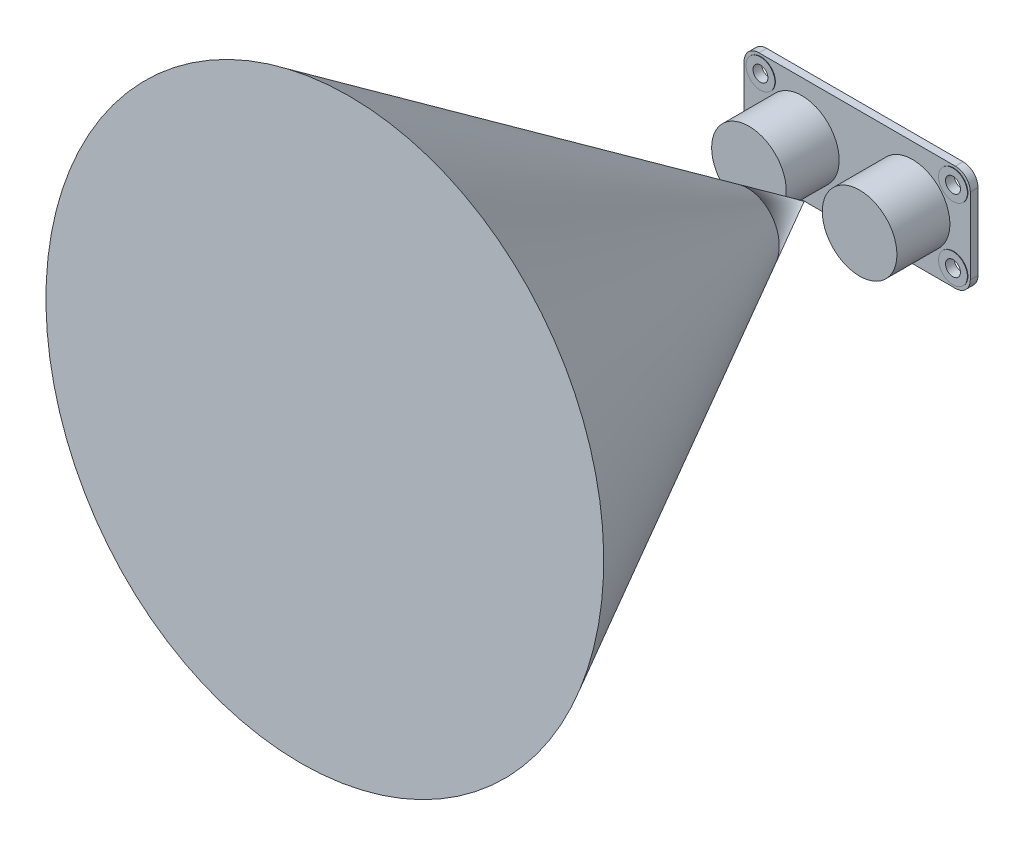
ISO-10303-21;
HEADER;
FILE_DESCRIPTION(('STEP AP214'),'2;1');
FILE_NAME('part.step','',(''),(''),'','','');
FILE_SCHEMA(('AUTOMOTIVE_DESIGN { 1 0 10303 214 1 1 1 1 }'));
ENDSEC;
DATA;
#1=APPLICATION_CONTEXT('core data for automotive mechanical design processes');
#2=APPLICATION_PROTOCOL_DEFINITION('international standard','automotive_design',2000,#1);
#3=PRODUCT_CONTEXT('',#1,'mechanical');
#4=PRODUCT('Part','Part','',(#3));
#5=PRODUCT_RELATED_PRODUCT_CATEGORY('part','',(#4));
#6=PRODUCT_DEFINITION_FORMATION('','',#4);
#7=PRODUCT_DEFINITION_CONTEXT('part definition',#1,'design');
#8=PRODUCT_DEFINITION('design','',#6,#7);
#9=PRODUCT_DEFINITION_SHAPE('','',#8);
#10=(LENGTH_UNIT() NAMED_UNIT(*) SI_UNIT(.MILLI.,.METRE.));
#11=(NAMED_UNIT(*) PLANE_ANGLE_UNIT() SI_UNIT($,.RADIAN.));
#12=(NAMED_UNIT(*) SI_UNIT($,.STERADIAN.) SOLID_ANGLE_UNIT());
#13=UNCERTAINTY_MEASURE_WITH_UNIT(LENGTH_MEASURE(1.E-05),#10,'distance_accuracy_value','');
#14=(GEOMETRIC_REPRESENTATION_CONTEXT(3) GLOBAL_UNCERTAINTY_ASSIGNED_CONTEXT((#13)) GLOBAL_UNIT_ASSIGNED_CONTEXT((#10,
#11,#12)) REPRESENTATION_CONTEXT('',''));
#15=CARTESIAN_POINT('',(0.,0.,0.));
#16=DIRECTION('',(0.,0.,1.));
#17=DIRECTION('',(1.,0.,0.));
#18=AXIS2_PLACEMENT_3D('',#15,#16,#17);
#19=CARTESIAN_POINT('',(0.,0.,12.6));
#20=DIRECTION('',(0.,0.0871557427476514,0.996194698091746));
#21=DIRECTION('',(0.,-0.996194698091746,0.0871557427476514));
#22=AXIS2_PLACEMENT_3D('',#19,#20,#21);
#23=CONICAL_SURFACE('',#22,0.,0.523598775598295);
#24=CARTESIAN_POINT('',(0.,8.71557427476514,112.219469809175));
#25=DIRECTION('',(0.,-0.0871557427476514,-0.996194698091746));
#26=DIRECTION('',(0.,0.996194698091746,-0.0871557427476514));
#27=AXIS2_PLACEMENT_3D('',#24,#25,#26);
#28=CIRCLE('',#27,57.7350269189621);
#29=CARTESIAN_POINT('',(0.,66.2309019856194,107.187530655497));
#30=VERTEX_POINT('',#29);
#31=EDGE_CURVE('E12',#30,#30,#28,.T.);
#32=ORIENTED_EDGE('',*,*,#31,.T.);
#33=EDGE_LOOP('',(#32));
#34=FACE_BOUND('',#33,.T.);
#35=CARTESIAN_POINT('',(0.,0.,12.6));
#36=VERTEX_POINT('',#35);
#37=VERTEX_LOOP('',#36);
#38=FACE_BOUND('',#37,.T.);
#39=ADVANCED_FACE('F61',(#34,#38),#23,.T.);
#40=CARTESIAN_POINT('',(0.,66.2309019856194,107.187530655497));
#41=DIRECTION('',(0.,0.0871557427476514,0.996194698091746));
#42=DIRECTION('',(0.,-0.996194698091746,0.0871557427476514));
#43=AXIS2_PLACEMENT_3D('',#40,#41,#42);
#44=PLANE('',#43);
#45=ORIENTED_EDGE('',*,*,#31,.F.);
#46=EDGE_LOOP('',(#45));
#47=FACE_BOUND('',#46,.T.);
#48=ADVANCED_FACE('F70',(#47),#44,.T.);
#49=CLOSED_SHELL('',(#39,#48));
#50=MANIFOLD_SOLID_BREP('B2_NOT_SHOWN',#49);
#51=CARTESIAN_POINT('',(0.,0.,1.6));
#52=DIRECTION('',(0.,0.,-1.));
#53=DIRECTION('',(-1.,0.,0.));
#54=AXIS2_PLACEMENT_3D('',#51,#52,#53);
#55=PLANE('',#54);
#56=CARTESIAN_POINT('',(-11.5,0.,1.6));
#57=DIRECTION('',(0.,0.,-1.));
#58=DIRECTION('',(-1.,0.,0.));
#59=AXIS2_PLACEMENT_3D('',#56,#57,#58);
#60=CIRCLE('',#59,7.75);
#61=CARTESIAN_POINT('',(-19.25,0.,1.6));
#62=VERTEX_POINT('',#61);
#63=EDGE_CURVE('E59',#62,#62,#60,.F.);
#64=ORIENTED_EDGE('',*,*,#63,.F.);
#65=EDGE_LOOP('',(#64));
#66=FACE_BOUND('',#65,.T.);
#67=CARTESIAN_POINT('',(11.5,0.,1.6));
#68=DIRECTION('',(0.,0.,-1.));
#69=DIRECTION('',(-1.,0.,0.));
#70=AXIS2_PLACEMENT_3D('',#67,#68,#69);
#71=CIRCLE('',#70,7.75);
#72=CARTESIAN_POINT('',(3.75,0.,1.6));
#73=VERTEX_POINT('',#72);
#74=EDGE_CURVE('E97',#73,#73,#71,.F.);
#75=ORIENTED_EDGE('',*,*,#74,.F.);
#76=EDGE_LOOP('',(#75));
#77=FACE_BOUND('',#76,.T.);
#78=CARTESIAN_POINT('',(20.,-7.5,1.6));
#79=DIRECTION('',(0.,0.,-1.));
#80=DIRECTION('',(-1.,0.,0.));
#81=AXIS2_PLACEMENT_3D('',#78,#79,#80);
#82=CIRCLE('',#81,3.);
#83=CARTESIAN_POINT('',(17.,-7.5,1.6));
#84=VERTEX_POINT('',#83);
#85=EDGE_CURVE('E238',#84,#84,#82,.T.);
#86=ORIENTED_EDGE('',*,*,#85,.T.);
#87=EDGE_LOOP('',(#86));
#88=FACE_BOUND('',#87,.T.);
#89=CARTESIAN_POINT('',(20.,7.5,1.6));
#90=DIRECTION('',(0.,0.,-1.));
#91=DIRECTION('',(-1.,0.,0.));
#92=AXIS2_PLACEMENT_3D('',#89,#90,#91);
#93=CIRCLE('',#92,3.);
#94=CARTESIAN_POINT('',(17.,7.5,1.6));
#95=VERTEX_POINT('',#94);
#96=EDGE_CURVE('E242',#95,#95,#93,.T.);
#97=ORIENTED_EDGE('',*,*,#96,.T.);
#98=EDGE_LOOP('',(#97));
#99=FACE_BOUND('',#98,.T.);
#100=CARTESIAN_POINT('',(-20.,-7.5,1.6));
#101=DIRECTION('',(0.,0.,-1.));
#102=DIRECTION('',(-1.,0.,0.));
#103=AXIS2_PLACEMENT_3D('',#100,#101,#102);
#104=CIRCLE('',#103,3.);
#105=CARTESIAN_POINT('',(-23.,-7.5,1.6));
#106=VERTEX_POINT('',#105);
#107=EDGE_CURVE('E246',#106,#106,#104,.T.);
#108=ORIENTED_EDGE('',*,*,#107,.T.);
#109=EDGE_LOOP('',(#108));
#110=FACE_BOUND('',#109,.T.);
#111=CARTESIAN_POINT('',(-20.,7.5,1.6));
#112=DIRECTION('',(0.,0.,-1.));
#113=DIRECTION('',(-1.,0.,0.));
#114=AXIS2_PLACEMENT_3D('',#111,#112,#113);
#115=CIRCLE('',#114,3.);
#116=CARTESIAN_POINT('',(-23.,7.5,1.6));
#117=VERTEX_POINT('',#116);
#118=EDGE_CURVE('E249',#117,#117,#115,.T.);
#119=ORIENTED_EDGE('',*,*,#118,.T.);
#120=EDGE_LOOP('',(#119));
#121=FACE_BOUND('',#120,.T.);
#122=DIRECTION('',(-1.,0.,0.));
#123=VECTOR('',#122,1.);
#124=CARTESIAN_POINT('',(-23.5,11.,1.6));
#125=LINE('',#124,#123);
#126=CARTESIAN_POINT('',(20.4,11.,1.6));
#127=VERTEX_POINT('',#126);
#128=CARTESIAN_POINT('',(-20.4,11.,1.6));
#129=VERTEX_POINT('',#128);
#130=EDGE_CURVE('E252',#127,#129,#125,.T.);
#131=ORIENTED_EDGE('',*,*,#130,.T.);
#132=CARTESIAN_POINT('',(-20.4,7.9,1.6));
#133=DIRECTION('',(0.,0.,-1.));
#134=DIRECTION('',(-1.,0.,0.));
#135=AXIS2_PLACEMENT_3D('',#132,#133,#134);
#136=CIRCLE('',#135,3.1);
#137=CARTESIAN_POINT('',(-23.5,7.9,1.6));
#138=VERTEX_POINT('',#137);
#139=EDGE_CURVE('E204',#129,#138,#136,.F.);
#140=ORIENTED_EDGE('',*,*,#139,.T.);
#141=DIRECTION('',(0.,-1.,0.));
#142=VECTOR('',#141,1.);
#143=CARTESIAN_POINT('',(-23.5,-11.,1.6));
#144=LINE('',#143,#142);
#145=CARTESIAN_POINT('',(-23.5,-7.9,1.6));
#146=VERTEX_POINT('',#145);
#147=EDGE_CURVE('E175',#138,#146,#144,.T.);
#148=ORIENTED_EDGE('',*,*,#147,.T.);
#149=CARTESIAN_POINT('',(-20.4,-7.9,1.6));
#150=DIRECTION('',(0.,0.,-1.));
#151=DIRECTION('',(-1.,0.,0.));
#152=AXIS2_PLACEMENT_3D('',#149,#150,#151);
#153=CIRCLE('',#152,3.1);
#154=CARTESIAN_POINT('',(-20.4,-11.,1.6));
#155=VERTEX_POINT('',#154);
#156=EDGE_CURVE('E111',#146,#155,#153,.F.);
#157=ORIENTED_EDGE('',*,*,#156,.T.);
#158=DIRECTION('',(1.,0.,0.));
#159=VECTOR('',#158,1.);
#160=CARTESIAN_POINT('',(-23.5,-11.,1.6));
#161=LINE('',#160,#159);
#162=CARTESIAN_POINT('',(20.4,-11.,1.6));
#163=VERTEX_POINT('',#162);
#164=EDGE_CURVE('E190',#155,#163,#161,.T.);
#165=ORIENTED_EDGE('',*,*,#164,.T.);
#166=CARTESIAN_POINT('',(20.4,-7.9,1.6));
#167=DIRECTION('',(0.,0.,-1.));
#168=DIRECTION('',(-1.,0.,0.));
#169=AXIS2_PLACEMENT_3D('',#166,#167,#168);
#170=CIRCLE('',#169,3.1);
#171=CARTESIAN_POINT('',(23.5,-7.9,1.6));
#172=VERTEX_POINT('',#171);
#173=EDGE_CURVE('E201',#163,#172,#170,.F.);
#174=ORIENTED_EDGE('',*,*,#173,.T.);
#175=DIRECTION('',(0.,1.,0.));
#176=VECTOR('',#175,1.);
#177=CARTESIAN_POINT('',(23.5,-11.,1.6));
#178=LINE('',#177,#176);
#179=CARTESIAN_POINT('',(23.5,7.9,1.6));
#180=VERTEX_POINT('',#179);
#181=EDGE_CURVE('E184',#172,#180,#178,.T.);
#182=ORIENTED_EDGE('',*,*,#181,.T.);
#183=CARTESIAN_POINT('',(20.4,7.9,1.6));
#184=DIRECTION('',(0.,0.,-1.));
#185=DIRECTION('',(-1.,0.,0.));
#186=AXIS2_PLACEMENT_3D('',#183,#184,#185);
#187=CIRCLE('',#186,3.1);
#188=EDGE_CURVE('E199',#180,#127,#187,.F.);
#189=ORIENTED_EDGE('',*,*,#188,.T.);
#190=EDGE_LOOP('',(#131,#140,#148,#157,#165,#174,#182,#189));
#191=FACE_BOUND('',#190,.T.);
#192=ADVANCED_FACE('F89',(#66,#77,#88,#99,#110,#121,#191),#55,.F.);
#193=CARTESIAN_POINT('',(0.,0.,0.));
#194=DIRECTION('',(0.,0.,-1.));
#195=DIRECTION('',(-1.,0.,0.));
#196=AXIS2_PLACEMENT_3D('',#193,#194,#195);
#197=PLANE('',#196);
#198=CARTESIAN_POINT('',(20.,-7.5,0.));
#199=DIRECTION('',(0.,0.,-1.));
#200=DIRECTION('',(-1.,0.,0.));
#201=AXIS2_PLACEMENT_3D('',#198,#199,#200);
#202=CIRCLE('',#201,3.);
#203=CARTESIAN_POINT('',(17.,-7.5,0.));
#204=VERTEX_POINT('',#203);
#205=EDGE_CURVE('E224',#204,#204,#202,.T.);
#206=ORIENTED_EDGE('',*,*,#205,.F.);
#207=EDGE_LOOP('',(#206));
#208=FACE_BOUND('',#207,.T.);
#209=CARTESIAN_POINT('',(20.,7.5,0.));
#210=DIRECTION('',(0.,0.,-1.));
#211=DIRECTION('',(-1.,0.,0.));
#212=AXIS2_PLACEMENT_3D('',#209,#210,#211);
#213=CIRCLE('',#212,3.);
#214=CARTESIAN_POINT('',(17.,7.5,0.));
#215=VERTEX_POINT('',#214);
#216=EDGE_CURVE('E221',#215,#215,#213,.T.);
#217=ORIENTED_EDGE('',*,*,#216,.F.);
#218=EDGE_LOOP('',(#217));
#219=FACE_BOUND('',#218,.T.);
#220=CARTESIAN_POINT('',(-20.,-7.5,0.));
#221=DIRECTION('',(0.,0.,-1.));
#222=DIRECTION('',(-1.,0.,0.));
#223=AXIS2_PLACEMENT_3D('',#220,#221,#222);
#224=CIRCLE('',#223,3.);
#225=CARTESIAN_POINT('',(-23.,-7.5,0.));
#226=VERTEX_POINT('',#225);
#227=EDGE_CURVE('E218',#226,#226,#224,.T.);
#228=ORIENTED_EDGE('',*,*,#227,.F.);
#229=EDGE_LOOP('',(#228));
#230=FACE_BOUND('',#229,.T.);
#231=CARTESIAN_POINT('',(-20.,7.5,0.));
#232=DIRECTION('',(0.,0.,-1.));
#233=DIRECTION('',(-1.,0.,0.));
#234=AXIS2_PLACEMENT_3D('',#231,#232,#233);
#235=CIRCLE('',#234,3.);
#236=CARTESIAN_POINT('',(-23.,7.5,0.));
#237=VERTEX_POINT('',#236);
#238=EDGE_CURVE('E215',#237,#237,#235,.T.);
#239=ORIENTED_EDGE('',*,*,#238,.F.);
#240=EDGE_LOOP('',(#239));
#241=FACE_BOUND('',#240,.T.);
#242=DIRECTION('',(0.,-1.,0.));
#243=VECTOR('',#242,1.);
#244=CARTESIAN_POINT('',(-23.5,-11.,0.));
#245=LINE('',#244,#243);
#246=CARTESIAN_POINT('',(-23.5,7.9,0.));
#247=VERTEX_POINT('',#246);
#248=CARTESIAN_POINT('',(-23.5,-7.9,0.));
#249=VERTEX_POINT('',#248);
#250=EDGE_CURVE('E173',#247,#249,#245,.T.);
#251=ORIENTED_EDGE('',*,*,#250,.F.);
#252=CARTESIAN_POINT('',(-20.4,7.9,0.));
#253=DIRECTION('',(0.,0.,-1.));
#254=DIRECTION('',(-1.,0.,0.));
#255=AXIS2_PLACEMENT_3D('',#252,#253,#254);
#256=CIRCLE('',#255,3.1);
#257=CARTESIAN_POINT('',(-20.4,11.,0.));
#258=VERTEX_POINT('',#257);
#259=EDGE_CURVE('E156',#247,#258,#256,.T.);
#260=ORIENTED_EDGE('',*,*,#259,.T.);
#261=DIRECTION('',(-1.,0.,0.));
#262=VECTOR('',#261,1.);
#263=CARTESIAN_POINT('',(-23.5,11.,0.));
#264=LINE('',#263,#262);
#265=CARTESIAN_POINT('',(20.4,11.,0.));
#266=VERTEX_POINT('',#265);
#267=EDGE_CURVE('E182',#266,#258,#264,.T.);
#268=ORIENTED_EDGE('',*,*,#267,.F.);
#269=CARTESIAN_POINT('',(20.4,7.9,0.));
#270=DIRECTION('',(0.,0.,-1.));
#271=DIRECTION('',(-1.,0.,0.));
#272=AXIS2_PLACEMENT_3D('',#269,#270,#271);
#273=CIRCLE('',#272,3.1);
#274=CARTESIAN_POINT('',(23.5,7.9,0.));
#275=VERTEX_POINT('',#274);
#276=EDGE_CURVE('E176',#266,#275,#273,.T.);
#277=ORIENTED_EDGE('',*,*,#276,.T.);
#278=DIRECTION('',(0.,1.,0.));
#279=VECTOR('',#278,1.);
#280=CARTESIAN_POINT('',(23.5,-11.,0.));
#281=LINE('',#280,#279);
#282=CARTESIAN_POINT('',(23.5,-7.9,0.));
#283=VERTEX_POINT('',#282);
#284=EDGE_CURVE('E186',#283,#275,#281,.T.);
#285=ORIENTED_EDGE('',*,*,#284,.F.);
#286=CARTESIAN_POINT('',(20.4,-7.9,0.));
#287=DIRECTION('',(0.,0.,-1.));
#288=DIRECTION('',(-1.,0.,0.));
#289=AXIS2_PLACEMENT_3D('',#286,#287,#288);
#290=CIRCLE('',#289,3.1);
#291=CARTESIAN_POINT('',(20.4,-11.,0.));
#292=VERTEX_POINT('',#291);
#293=EDGE_CURVE('E193',#283,#292,#290,.T.);
#294=ORIENTED_EDGE('',*,*,#293,.T.);
#295=DIRECTION('',(1.,0.,0.));
#296=VECTOR('',#295,1.);
#297=CARTESIAN_POINT('',(-23.5,-11.,0.));
#298=LINE('',#297,#296);
#299=CARTESIAN_POINT('',(-20.4,-11.,0.));
#300=VERTEX_POINT('',#299);
#301=EDGE_CURVE('E181',#300,#292,#298,.T.);
#302=ORIENTED_EDGE('',*,*,#301,.F.);
#303=CARTESIAN_POINT('',(-20.4,-7.9,0.));
#304=DIRECTION('',(0.,0.,-1.));
#305=DIRECTION('',(-1.,0.,0.));
#306=AXIS2_PLACEMENT_3D('',#303,#304,#305);
#307=CIRCLE('',#306,3.1);
#308=EDGE_CURVE('E167',#300,#249,#307,.T.);
#309=ORIENTED_EDGE('',*,*,#308,.T.);
#310=EDGE_LOOP('',(#251,#260,#268,#277,#285,#294,#302,#309));
#311=FACE_BOUND('',#310,.T.);
#312=ADVANCED_FACE('F179',(#208,#219,#230,#241,#311),#197,.T.);
#313=CARTESIAN_POINT('',(23.5,-11.,1.6));
#314=DIRECTION('',(-1.,0.,0.));
#315=DIRECTION('',(0.,0.,1.));
#316=AXIS2_PLACEMENT_3D('',#313,#314,#315);
#317=PLANE('',#316);
#318=ORIENTED_EDGE('',*,*,#181,.F.);
#319=DIRECTION('',(0.,0.,-1.));
#320=VECTOR('',#319,1.);
#321=CARTESIAN_POINT('',(23.5,-7.9,1.6));
#322=LINE('',#321,#320);
#323=EDGE_CURVE('E212',#172,#283,#322,.T.);
#324=ORIENTED_EDGE('',*,*,#323,.T.);
#325=ORIENTED_EDGE('',*,*,#284,.T.);
#326=DIRECTION('',(0.,0.,-1.));
#327=VECTOR('',#326,1.);
#328=CARTESIAN_POINT('',(23.5,7.9,1.6));
#329=LINE('',#328,#327);
#330=EDGE_CURVE('E210',#275,#180,#329,.F.);
#331=ORIENTED_EDGE('',*,*,#330,.T.);
#332=EDGE_LOOP('',(#318,#324,#325,#331));
#333=FACE_BOUND('',#332,.T.);
#334=ADVANCED_FACE('F414',(#333),#317,.F.);
#335=CARTESIAN_POINT('',(-23.5,11.,1.6));
#336=DIRECTION('',(0.,-1.,0.));
#337=DIRECTION('',(0.,0.,-1.));
#338=AXIS2_PLACEMENT_3D('',#335,#336,#337);
#339=PLANE('',#338);
#340=ORIENTED_EDGE('',*,*,#267,.T.);
#341=DIRECTION('',(0.,0.,-1.));
#342=VECTOR('',#341,1.);
#343=CARTESIAN_POINT('',(-20.4,11.,1.6));
#344=LINE('',#343,#342);
#345=EDGE_CURVE('E161',#258,#129,#344,.F.);
#346=ORIENTED_EDGE('',*,*,#345,.T.);
#347=ORIENTED_EDGE('',*,*,#130,.F.);
#348=DIRECTION('',(0.,0.,-1.));
#349=VECTOR('',#348,1.);
#350=CARTESIAN_POINT('',(20.4,11.,1.6));
#351=LINE('',#350,#349);
#352=EDGE_CURVE('E166',#127,#266,#351,.T.);
#353=ORIENTED_EDGE('',*,*,#352,.T.);
#354=EDGE_LOOP('',(#340,#346,#347,#353));
#355=FACE_BOUND('',#354,.T.);
#356=ADVANCED_FACE('F421',(#355),#339,.F.);
#357=CARTESIAN_POINT('',(-23.5,-11.,1.6));
#358=DIRECTION('',(1.,0.,0.));
#359=DIRECTION('',(0.,0.,-1.));
#360=AXIS2_PLACEMENT_3D('',#357,#358,#359);
#361=PLANE('',#360);
#362=ORIENTED_EDGE('',*,*,#147,.F.);
#363=DIRECTION('',(0.,0.,-1.));
#364=VECTOR('',#363,1.);
#365=CARTESIAN_POINT('',(-23.5,7.9,1.6));
#366=LINE('',#365,#364);
#367=EDGE_CURVE('E160',#138,#247,#366,.T.);
#368=ORIENTED_EDGE('',*,*,#367,.T.);
#369=ORIENTED_EDGE('',*,*,#250,.T.);
#370=DIRECTION('',(0.,0.,-1.));
#371=VECTOR('',#370,1.);
#372=CARTESIAN_POINT('',(-23.5,-7.9,1.6));
#373=LINE('',#372,#371);
#374=EDGE_CURVE('E177',#249,#146,#373,.F.);
#375=ORIENTED_EDGE('',*,*,#374,.T.);
#376=EDGE_LOOP('',(#362,#368,#369,#375));
#377=FACE_BOUND('',#376,.T.);
#378=ADVANCED_FACE('F172',(#377),#361,.F.);
#379=CARTESIAN_POINT('',(-23.5,-11.,1.6));
#380=DIRECTION('',(0.,1.,0.));
#381=DIRECTION('',(0.,0.,1.));
#382=AXIS2_PLACEMENT_3D('',#379,#380,#381);
#383=PLANE('',#382);
#384=ORIENTED_EDGE('',*,*,#164,.F.);
#385=DIRECTION('',(0.,0.,-1.));
#386=VECTOR('',#385,1.);
#387=CARTESIAN_POINT('',(-20.4,-11.,1.6));
#388=LINE('',#387,#386);
#389=EDGE_CURVE('E207',#155,#300,#388,.T.);
#390=ORIENTED_EDGE('',*,*,#389,.T.);
#391=ORIENTED_EDGE('',*,*,#301,.T.);
#392=DIRECTION('',(0.,0.,-1.));
#393=VECTOR('',#392,1.);
#394=CARTESIAN_POINT('',(20.4,-11.,1.6));
#395=LINE('',#394,#393);
#396=EDGE_CURVE('E104',#292,#163,#395,.F.);
#397=ORIENTED_EDGE('',*,*,#396,.T.);
#398=EDGE_LOOP('',(#384,#390,#391,#397));
#399=FACE_BOUND('',#398,.T.);
#400=ADVANCED_FACE('F416',(#399),#383,.F.);
#401=CARTESIAN_POINT('',(-20.4,7.9,1.6));
#402=DIRECTION('',(0.,0.,-1.));
#403=DIRECTION('',(-1.,0.,0.));
#404=AXIS2_PLACEMENT_3D('',#401,#402,#403);
#405=CYLINDRICAL_SURFACE('',#404,3.1);
#406=ORIENTED_EDGE('',*,*,#139,.F.);
#407=ORIENTED_EDGE('',*,*,#345,.F.);
#408=ORIENTED_EDGE('',*,*,#259,.F.);
#409=ORIENTED_EDGE('',*,*,#367,.F.);
#410=EDGE_LOOP('',(#406,#407,#408,#409));
#411=FACE_BOUND('',#410,.T.);
#412=ADVANCED_FACE('F159',(#411),#405,.T.);
#413=CARTESIAN_POINT('',(-20.4,-7.9,1.6));
#414=DIRECTION('',(0.,0.,-1.));
#415=DIRECTION('',(-1.,0.,0.));
#416=AXIS2_PLACEMENT_3D('',#413,#414,#415);
#417=CYLINDRICAL_SURFACE('',#416,3.1);
#418=ORIENTED_EDGE('',*,*,#156,.F.);
#419=ORIENTED_EDGE('',*,*,#374,.F.);
#420=ORIENTED_EDGE('',*,*,#308,.F.);
#421=ORIENTED_EDGE('',*,*,#389,.F.);
#422=EDGE_LOOP('',(#418,#419,#420,#421));
#423=FACE_BOUND('',#422,.T.);
#424=ADVANCED_FACE('F428',(#423),#417,.T.);
#425=CARTESIAN_POINT('',(20.4,-7.9,1.6));
#426=DIRECTION('',(0.,0.,-1.));
#427=DIRECTION('',(-1.,0.,0.));
#428=AXIS2_PLACEMENT_3D('',#425,#426,#427);
#429=CYLINDRICAL_SURFACE('',#428,3.1);
#430=ORIENTED_EDGE('',*,*,#173,.F.);
#431=ORIENTED_EDGE('',*,*,#396,.F.);
#432=ORIENTED_EDGE('',*,*,#293,.F.);
#433=ORIENTED_EDGE('',*,*,#323,.F.);
#434=EDGE_LOOP('',(#430,#431,#432,#433));
#435=FACE_BOUND('',#434,.T.);
#436=ADVANCED_FACE('F430',(#435),#429,.T.);
#437=CARTESIAN_POINT('',(20.4,7.9,1.6));
#438=DIRECTION('',(0.,0.,-1.));
#439=DIRECTION('',(-1.,0.,0.));
#440=AXIS2_PLACEMENT_3D('',#437,#438,#439);
#441=CYLINDRICAL_SURFACE('',#440,3.1);
#442=ORIENTED_EDGE('',*,*,#188,.F.);
#443=ORIENTED_EDGE('',*,*,#330,.F.);
#444=ORIENTED_EDGE('',*,*,#276,.F.);
#445=ORIENTED_EDGE('',*,*,#352,.F.);
#446=EDGE_LOOP('',(#442,#443,#444,#445));
#447=FACE_BOUND('',#446,.T.);
#448=ADVANCED_FACE('F91',(#447),#441,.T.);
#449=CARTESIAN_POINT('',(-20.,7.5,-0.0999999999999998));
#450=DIRECTION('',(0.,0.,1.));
#451=DIRECTION('',(1.,0.,0.));
#452=AXIS2_PLACEMENT_3D('',#449,#450,#451);
#453=CYLINDRICAL_SURFACE('',#452,3.);
#454=ORIENTED_EDGE('',*,*,#238,.T.);
#455=EDGE_LOOP('',(#454));
#456=FACE_BOUND('',#455,.T.);
#457=CARTESIAN_POINT('',(-20.,7.5,-0.0999999999999998));
#458=DIRECTION('',(0.,0.,1.));
#459=DIRECTION('',(1.,0.,0.));
#460=AXIS2_PLACEMENT_3D('',#457,#458,#459);
#461=CIRCLE('',#460,3.);
#462=CARTESIAN_POINT('',(-17.,7.5,-0.0999999999999998));
#463=VERTEX_POINT('',#462);
#464=EDGE_CURVE('E266',#463,#463,#461,.T.);
#465=ORIENTED_EDGE('',*,*,#464,.T.);
#466=EDGE_LOOP('',(#465));
#467=FACE_BOUND('',#466,.T.);
#468=ADVANCED_FACE('F395',(#456,#467),#453,.T.);
#469=CARTESIAN_POINT('',(-20.,7.5,-0.0999999999999998));
#470=DIRECTION('',(0.,0.,1.));
#471=DIRECTION('',(1.,0.,0.));
#472=AXIS2_PLACEMENT_3D('',#469,#470,#471);
#473=PLANE('',#472);
#474=CARTESIAN_POINT('',(-20.,7.5,-0.0999999999999998));
#475=DIRECTION('',(0.,0.,1.));
#476=DIRECTION('',(1.,0.,0.));
#477=AXIS2_PLACEMENT_3D('',#474,#475,#476);
#478=CIRCLE('',#477,1.55);
#479=CARTESIAN_POINT('',(-18.45,7.5,-0.0999999999999998));
#480=VERTEX_POINT('',#479);
#481=EDGE_CURVE('E268',#480,#480,#478,.T.);
#482=ORIENTED_EDGE('',*,*,#481,.T.);
#483=EDGE_LOOP('',(#482));
#484=FACE_BOUND('',#483,.T.);
#485=ORIENTED_EDGE('',*,*,#464,.F.);
#486=EDGE_LOOP('',(#485));
#487=FACE_BOUND('',#486,.T.);
#488=ADVANCED_FACE('F391',(#484,#487),#473,.F.);
#489=CARTESIAN_POINT('',(-20.,7.5,1.6));
#490=DIRECTION('',(0.,0.,-1.));
#491=DIRECTION('',(-1.,0.,0.));
#492=AXIS2_PLACEMENT_3D('',#489,#490,#491);
#493=CYLINDRICAL_SURFACE('',#492,1.55);
#494=ORIENTED_EDGE('',*,*,#481,.F.);
#495=EDGE_LOOP('',(#494));
#496=FACE_BOUND('',#495,.T.);
#497=CARTESIAN_POINT('',(-20.,7.5,1.7));
#498=DIRECTION('',(0.,0.,1.));
#499=DIRECTION('',(1.,0.,0.));
#500=AXIS2_PLACEMENT_3D('',#497,#498,#499);
#501=CIRCLE('',#500,1.55);
#502=CARTESIAN_POINT('',(-18.45,7.5,1.7));
#503=VERTEX_POINT('',#502);
#504=EDGE_CURVE('E276',#503,#503,#501,.T.);
#505=ORIENTED_EDGE('',*,*,#504,.T.);
#506=EDGE_LOOP('',(#505));
#507=FACE_BOUND('',#506,.T.);
#508=ADVANCED_FACE('F394',(#496,#507),#493,.F.);
#509=CARTESIAN_POINT('',(-20.,7.5,1.7));
#510=DIRECTION('',(0.,0.,1.));
#511=DIRECTION('',(1.,0.,0.));
#512=AXIS2_PLACEMENT_3D('',#509,#510,#511);
#513=CIRCLE('',#512,3.);
#514=CARTESIAN_POINT('',(-17.,7.5,1.7));
#515=VERTEX_POINT('',#514);
#516=EDGE_CURVE('E273',#515,#515,#513,.T.);
#517=ORIENTED_EDGE('',*,*,#516,.F.);
#518=EDGE_LOOP('',(#517));
#519=FACE_BOUND('',#518,.T.);
#520=ORIENTED_EDGE('',*,*,#118,.F.);
#521=EDGE_LOOP('',(#520));
#522=FACE_BOUND('',#521,.T.);
#523=ADVANCED_FACE('F389',(#519,#522),#453,.T.);
#524=CARTESIAN_POINT('',(-20.,7.5,1.7));
#525=DIRECTION('',(0.,0.,1.));
#526=DIRECTION('',(1.,0.,0.));
#527=AXIS2_PLACEMENT_3D('',#524,#525,#526);
#528=PLANE('',#527);
#529=ORIENTED_EDGE('',*,*,#516,.T.);
#530=EDGE_LOOP('',(#529));
#531=FACE_BOUND('',#530,.T.);
#532=ORIENTED_EDGE('',*,*,#504,.F.);
#533=EDGE_LOOP('',(#532));
#534=FACE_BOUND('',#533,.T.);
#535=ADVANCED_FACE('F385',(#531,#534),#528,.T.);
#536=CARTESIAN_POINT('',(-20.,-7.5,-0.0999999999999998));
#537=DIRECTION('',(0.,0.,1.));
#538=DIRECTION('',(1.,0.,0.));
#539=AXIS2_PLACEMENT_3D('',#536,#537,#538);
#540=CYLINDRICAL_SURFACE('',#539,3.);
#541=ORIENTED_EDGE('',*,*,#227,.T.);
#542=EDGE_LOOP('',(#541));
#543=FACE_BOUND('',#542,.T.);
#544=CARTESIAN_POINT('',(-20.,-7.5,-0.0999999999999998));
#545=DIRECTION('',(0.,0.,1.));
#546=DIRECTION('',(1.,0.,0.));
#547=AXIS2_PLACEMENT_3D('',#544,#545,#546);
#548=CIRCLE('',#547,3.);
#549=CARTESIAN_POINT('',(-17.,-7.5,-0.0999999999999998));
#550=VERTEX_POINT('',#549);
#551=EDGE_CURVE('E280',#550,#550,#548,.T.);
#552=ORIENTED_EDGE('',*,*,#551,.T.);
#553=EDGE_LOOP('',(#552));
#554=FACE_BOUND('',#553,.T.);
#555=ADVANCED_FACE('F381',(#543,#554),#540,.T.);
#556=CARTESIAN_POINT('',(-20.,-7.5,-0.0999999999999998));
#557=DIRECTION('',(0.,0.,1.));
#558=DIRECTION('',(1.,0.,0.));
#559=AXIS2_PLACEMENT_3D('',#556,#557,#558);
#560=PLANE('',#559);
#561=CARTESIAN_POINT('',(-20.,-7.5,-0.0999999999999998));
#562=DIRECTION('',(0.,0.,1.));
#563=DIRECTION('',(1.,0.,0.));
#564=AXIS2_PLACEMENT_3D('',#561,#562,#563);
#565=CIRCLE('',#564,1.55);
#566=CARTESIAN_POINT('',(-18.45,-7.5,-0.0999999999999998));
#567=VERTEX_POINT('',#566);
#568=EDGE_CURVE('E283',#567,#567,#565,.T.);
#569=ORIENTED_EDGE('',*,*,#568,.T.);
#570=EDGE_LOOP('',(#569));
#571=FACE_BOUND('',#570,.T.);
#572=ORIENTED_EDGE('',*,*,#551,.F.);
#573=EDGE_LOOP('',(#572));
#574=FACE_BOUND('',#573,.T.);
#575=ADVANCED_FACE('F377',(#571,#574),#560,.F.);
#576=CARTESIAN_POINT('',(-20.,-7.5,1.6));
#577=DIRECTION('',(0.,0.,-1.));
#578=DIRECTION('',(-1.,0.,0.));
#579=AXIS2_PLACEMENT_3D('',#576,#577,#578);
#580=CYLINDRICAL_SURFACE('',#579,1.55);
#581=ORIENTED_EDGE('',*,*,#568,.F.);
#582=EDGE_LOOP('',(#581));
#583=FACE_BOUND('',#582,.T.);
#584=CARTESIAN_POINT('',(-20.,-7.5,1.7));
#585=DIRECTION('',(0.,0.,1.));
#586=DIRECTION('',(1.,0.,0.));
#587=AXIS2_PLACEMENT_3D('',#584,#585,#586);
#588=CIRCLE('',#587,1.55);
#589=CARTESIAN_POINT('',(-18.45,-7.5,1.7));
#590=VERTEX_POINT('',#589);
#591=EDGE_CURVE('E289',#590,#590,#588,.T.);
#592=ORIENTED_EDGE('',*,*,#591,.T.);
#593=EDGE_LOOP('',(#592));
#594=FACE_BOUND('',#593,.T.);
#595=ADVANCED_FACE('F380',(#583,#594),#580,.F.);
#596=CARTESIAN_POINT('',(-20.,-7.5,1.7));
#597=DIRECTION('',(0.,0.,1.));
#598=DIRECTION('',(1.,0.,0.));
#599=AXIS2_PLACEMENT_3D('',#596,#597,#598);
#600=CIRCLE('',#599,3.);
#601=CARTESIAN_POINT('',(-17.,-7.5,1.7));
#602=VERTEX_POINT('',#601);
#603=EDGE_CURVE('E286',#602,#602,#600,.T.);
#604=ORIENTED_EDGE('',*,*,#603,.F.);
#605=EDGE_LOOP('',(#604));
#606=FACE_BOUND('',#605,.T.);
#607=ORIENTED_EDGE('',*,*,#107,.F.);
#608=EDGE_LOOP('',(#607));
#609=FACE_BOUND('',#608,.T.);
#610=ADVANCED_FACE('F375',(#606,#609),#540,.T.);
#611=CARTESIAN_POINT('',(-20.,-7.5,1.7));
#612=DIRECTION('',(0.,0.,1.));
#613=DIRECTION('',(1.,0.,0.));
#614=AXIS2_PLACEMENT_3D('',#611,#612,#613);
#615=PLANE('',#614);
#616=ORIENTED_EDGE('',*,*,#603,.T.);
#617=EDGE_LOOP('',(#616));
#618=FACE_BOUND('',#617,.T.);
#619=ORIENTED_EDGE('',*,*,#591,.F.);
#620=EDGE_LOOP('',(#619));
#621=FACE_BOUND('',#620,.T.);
#622=ADVANCED_FACE('F371',(#618,#621),#615,.T.);
#623=CARTESIAN_POINT('',(20.,7.5,-0.0999999999999998));
#624=DIRECTION('',(0.,0.,1.));
#625=DIRECTION('',(1.,0.,0.));
#626=AXIS2_PLACEMENT_3D('',#623,#624,#625);
#627=CYLINDRICAL_SURFACE('',#626,3.);
#628=ORIENTED_EDGE('',*,*,#216,.T.);
#629=EDGE_LOOP('',(#628));
#630=FACE_BOUND('',#629,.T.);
#631=CARTESIAN_POINT('',(20.,7.5,-0.0999999999999998));
#632=DIRECTION('',(0.,0.,1.));
#633=DIRECTION('',(1.,0.,0.));
#634=AXIS2_PLACEMENT_3D('',#631,#632,#633);
#635=CIRCLE('',#634,3.);
#636=CARTESIAN_POINT('',(23.,7.5,-0.0999999999999998));
#637=VERTEX_POINT('',#636);
#638=EDGE_CURVE('E293',#637,#637,#635,.T.);
#639=ORIENTED_EDGE('',*,*,#638,.T.);
#640=EDGE_LOOP('',(#639));
#641=FACE_BOUND('',#640,.T.);
#642=ADVANCED_FACE('F367',(#630,#641),#627,.T.);
#643=CARTESIAN_POINT('',(20.,7.5,-0.0999999999999998));
#644=DIRECTION('',(0.,0.,1.));
#645=DIRECTION('',(1.,0.,0.));
#646=AXIS2_PLACEMENT_3D('',#643,#644,#645);
#647=PLANE('',#646);
#648=CARTESIAN_POINT('',(20.,7.5,-0.0999999999999998));
#649=DIRECTION('',(0.,0.,1.));
#650=DIRECTION('',(1.,0.,0.));
#651=AXIS2_PLACEMENT_3D('',#648,#649,#650);
#652=CIRCLE('',#651,1.55);
#653=CARTESIAN_POINT('',(21.55,7.5,-0.0999999999999998));
#654=VERTEX_POINT('',#653);
#655=EDGE_CURVE('E296',#654,#654,#652,.T.);
#656=ORIENTED_EDGE('',*,*,#655,.T.);
#657=EDGE_LOOP('',(#656));
#658=FACE_BOUND('',#657,.T.);
#659=ORIENTED_EDGE('',*,*,#638,.F.);
#660=EDGE_LOOP('',(#659));
#661=FACE_BOUND('',#660,.T.);
#662=ADVANCED_FACE('F363',(#658,#661),#647,.F.);
#663=CARTESIAN_POINT('',(20.,7.5,1.6));
#664=DIRECTION('',(0.,0.,-1.));
#665=DIRECTION('',(-1.,0.,0.));
#666=AXIS2_PLACEMENT_3D('',#663,#664,#665);
#667=CYLINDRICAL_SURFACE('',#666,1.55);
#668=ORIENTED_EDGE('',*,*,#655,.F.);
#669=EDGE_LOOP('',(#668));
#670=FACE_BOUND('',#669,.T.);
#671=CARTESIAN_POINT('',(20.,7.5,1.7));
#672=DIRECTION('',(0.,0.,1.));
#673=DIRECTION('',(1.,0.,0.));
#674=AXIS2_PLACEMENT_3D('',#671,#672,#673);
#675=CIRCLE('',#674,1.55);
#676=CARTESIAN_POINT('',(21.55,7.5,1.7));
#677=VERTEX_POINT('',#676);
#678=EDGE_CURVE('E302',#677,#677,#675,.T.);
#679=ORIENTED_EDGE('',*,*,#678,.T.);
#680=EDGE_LOOP('',(#679));
#681=FACE_BOUND('',#680,.T.);
#682=ADVANCED_FACE('F366',(#670,#681),#667,.F.);
#683=CARTESIAN_POINT('',(20.,7.5,1.7));
#684=DIRECTION('',(0.,0.,1.));
#685=DIRECTION('',(1.,0.,0.));
#686=AXIS2_PLACEMENT_3D('',#683,#684,#685);
#687=CIRCLE('',#686,3.);
#688=CARTESIAN_POINT('',(23.,7.5,1.7));
#689=VERTEX_POINT('',#688);
#690=EDGE_CURVE('E299',#689,#689,#687,.T.);
#691=ORIENTED_EDGE('',*,*,#690,.F.);
#692=EDGE_LOOP('',(#691));
#693=FACE_BOUND('',#692,.T.);
#694=ORIENTED_EDGE('',*,*,#96,.F.);
#695=EDGE_LOOP('',(#694));
#696=FACE_BOUND('',#695,.T.);
#697=ADVANCED_FACE('F361',(#693,#696),#627,.T.);
#698=CARTESIAN_POINT('',(20.,7.5,1.7));
#699=DIRECTION('',(0.,0.,1.));
#700=DIRECTION('',(1.,0.,0.));
#701=AXIS2_PLACEMENT_3D('',#698,#699,#700);
#702=PLANE('',#701);
#703=ORIENTED_EDGE('',*,*,#690,.T.);
#704=EDGE_LOOP('',(#703));
#705=FACE_BOUND('',#704,.T.);
#706=ORIENTED_EDGE('',*,*,#678,.F.);
#707=EDGE_LOOP('',(#706));
#708=FACE_BOUND('',#707,.T.);
#709=ADVANCED_FACE('F357',(#705,#708),#702,.T.);
#710=CARTESIAN_POINT('',(20.,-7.5,-0.0999999999999998));
#711=DIRECTION('',(0.,0.,1.));
#712=DIRECTION('',(1.,0.,0.));
#713=AXIS2_PLACEMENT_3D('',#710,#711,#712);
#714=CYLINDRICAL_SURFACE('',#713,3.);
#715=ORIENTED_EDGE('',*,*,#205,.T.);
#716=EDGE_LOOP('',(#715));
#717=FACE_BOUND('',#716,.T.);
#718=CARTESIAN_POINT('',(20.,-7.5,-0.0999999999999998));
#719=DIRECTION('',(0.,0.,1.));
#720=DIRECTION('',(1.,0.,0.));
#721=AXIS2_PLACEMENT_3D('',#718,#719,#720);
#722=CIRCLE('',#721,3.);
#723=CARTESIAN_POINT('',(23.,-7.5,-0.0999999999999998));
#724=VERTEX_POINT('',#723);
#725=EDGE_CURVE('E306',#724,#724,#722,.T.);
#726=ORIENTED_EDGE('',*,*,#725,.T.);
#727=EDGE_LOOP('',(#726));
#728=FACE_BOUND('',#727,.T.);
#729=ADVANCED_FACE('F353',(#717,#728),#714,.T.);
#730=CARTESIAN_POINT('',(20.,-7.5,-0.0999999999999998));
#731=DIRECTION('',(0.,0.,1.));
#732=DIRECTION('',(1.,0.,0.));
#733=AXIS2_PLACEMENT_3D('',#730,#731,#732);
#734=PLANE('',#733);
#735=CARTESIAN_POINT('',(20.,-7.5,-0.0999999999999998));
#736=DIRECTION('',(0.,0.,1.));
#737=DIRECTION('',(1.,0.,0.));
#738=AXIS2_PLACEMENT_3D('',#735,#736,#737);
#739=CIRCLE('',#738,1.55);
#740=CARTESIAN_POINT('',(21.55,-7.5,-0.0999999999999998));
#741=VERTEX_POINT('',#740);
#742=EDGE_CURVE('E309',#741,#741,#739,.T.);
#743=ORIENTED_EDGE('',*,*,#742,.T.);
#744=EDGE_LOOP('',(#743));
#745=FACE_BOUND('',#744,.T.);
#746=ORIENTED_EDGE('',*,*,#725,.F.);
#747=EDGE_LOOP('',(#746));
#748=FACE_BOUND('',#747,.T.);
#749=ADVANCED_FACE('F349',(#745,#748),#734,.F.);
#750=CARTESIAN_POINT('',(20.,-7.5,1.6));
#751=DIRECTION('',(0.,0.,-1.));
#752=DIRECTION('',(-1.,0.,0.));
#753=AXIS2_PLACEMENT_3D('',#750,#751,#752);
#754=CYLINDRICAL_SURFACE('',#753,1.55);
#755=ORIENTED_EDGE('',*,*,#742,.F.);
#756=EDGE_LOOP('',(#755));
#757=FACE_BOUND('',#756,.T.);
#758=CARTESIAN_POINT('',(20.,-7.5,1.7));
#759=DIRECTION('',(0.,0.,1.));
#760=DIRECTION('',(1.,0.,0.));
#761=AXIS2_PLACEMENT_3D('',#758,#759,#760);
#762=CIRCLE('',#761,1.55);
#763=CARTESIAN_POINT('',(21.55,-7.5,1.7));
#764=VERTEX_POINT('',#763);
#765=EDGE_CURVE('E315',#764,#764,#762,.T.);
#766=ORIENTED_EDGE('',*,*,#765,.T.);
#767=EDGE_LOOP('',(#766));
#768=FACE_BOUND('',#767,.T.);
#769=ADVANCED_FACE('F352',(#757,#768),#754,.F.);
#770=CARTESIAN_POINT('',(20.,-7.5,1.7));
#771=DIRECTION('',(0.,0.,1.));
#772=DIRECTION('',(1.,0.,0.));
#773=AXIS2_PLACEMENT_3D('',#770,#771,#772);
#774=CIRCLE('',#773,3.);
#775=CARTESIAN_POINT('',(23.,-7.5,1.7));
#776=VERTEX_POINT('',#775);
#777=EDGE_CURVE('E312',#776,#776,#774,.T.);
#778=ORIENTED_EDGE('',*,*,#777,.F.);
#779=EDGE_LOOP('',(#778));
#780=FACE_BOUND('',#779,.T.);
#781=ORIENTED_EDGE('',*,*,#85,.F.);
#782=EDGE_LOOP('',(#781));
#783=FACE_BOUND('',#782,.T.);
#784=ADVANCED_FACE('F347',(#780,#783),#714,.T.);
#785=CARTESIAN_POINT('',(20.,-7.5,1.7));
#786=DIRECTION('',(0.,0.,1.));
#787=DIRECTION('',(1.,0.,0.));
#788=AXIS2_PLACEMENT_3D('',#785,#786,#787);
#789=PLANE('',#788);
#790=ORIENTED_EDGE('',*,*,#777,.T.);
#791=EDGE_LOOP('',(#790));
#792=FACE_BOUND('',#791,.T.);
#793=ORIENTED_EDGE('',*,*,#765,.F.);
#794=EDGE_LOOP('',(#793));
#795=FACE_BOUND('',#794,.T.);
#796=ADVANCED_FACE('F343',(#792,#795),#789,.T.);
#797=CARTESIAN_POINT('',(11.5,0.,12.6));
#798=DIRECTION('',(0.,0.,-1.));
#799=DIRECTION('',(-1.,0.,0.));
#800=AXIS2_PLACEMENT_3D('',#797,#798,#799);
#801=CYLINDRICAL_SURFACE('',#800,7.75);
#802=CARTESIAN_POINT('',(11.5,0.,12.6));
#803=DIRECTION('',(0.,0.,1.));
#804=DIRECTION('',(1.,0.,0.));
#805=AXIS2_PLACEMENT_3D('',#802,#803,#804);
#806=CIRCLE('',#805,7.75);
#807=CARTESIAN_POINT('',(19.25,0.,12.6));
#808=VERTEX_POINT('',#807);
#809=EDGE_CURVE('E318',#808,#808,#806,.T.);
#810=ORIENTED_EDGE('',*,*,#809,.F.);
#811=EDGE_LOOP('',(#810));
#812=FACE_BOUND('',#811,.T.);
#813=ORIENTED_EDGE('',*,*,#74,.T.);
#814=EDGE_LOOP('',(#813));
#815=FACE_BOUND('',#814,.T.);
#816=ADVANCED_FACE('F229',(#812,#815),#801,.T.);
#817=CARTESIAN_POINT('',(11.5,0.,12.6));
#818=DIRECTION('',(0.,0.,1.));
#819=DIRECTION('',(1.,0.,0.));
#820=AXIS2_PLACEMENT_3D('',#817,#818,#819);
#821=PLANE('',#820);
#822=ORIENTED_EDGE('',*,*,#809,.T.);
#823=EDGE_LOOP('',(#822));
#824=FACE_BOUND('',#823,.T.);
#825=ADVANCED_FACE('F330',(#824),#821,.T.);
#826=CARTESIAN_POINT('',(-11.5,0.,12.6));
#827=DIRECTION('',(0.,0.,-1.));
#828=DIRECTION('',(-1.,0.,0.));
#829=AXIS2_PLACEMENT_3D('',#826,#827,#828);
#830=CYLINDRICAL_SURFACE('',#829,7.75);
#831=CARTESIAN_POINT('',(-11.5,0.,12.6));
#832=DIRECTION('',(0.,0.,1.));
#833=DIRECTION('',(1.,0.,0.));
#834=AXIS2_PLACEMENT_3D('',#831,#832,#833);
#835=CIRCLE('',#834,7.75);
#836=CARTESIAN_POINT('',(-3.75,0.,12.6));
#837=VERTEX_POINT('',#836);
#838=EDGE_CURVE('E321',#837,#837,#835,.T.);
#839=ORIENTED_EDGE('',*,*,#838,.F.);
#840=EDGE_LOOP('',(#839));
#841=FACE_BOUND('',#840,.T.);
#842=ORIENTED_EDGE('',*,*,#63,.T.);
#843=EDGE_LOOP('',(#842));
#844=FACE_BOUND('',#843,.T.);
#845=ADVANCED_FACE('F327',(#841,#844),#830,.T.);
#846=CARTESIAN_POINT('',(-11.5,0.,12.6));
#847=DIRECTION('',(0.,0.,1.));
#848=DIRECTION('',(1.,0.,0.));
#849=AXIS2_PLACEMENT_3D('',#846,#847,#848);
#850=PLANE('',#849);
#851=ORIENTED_EDGE('',*,*,#838,.T.);
#852=EDGE_LOOP('',(#851));
#853=FACE_BOUND('',#852,.T.);
#854=ADVANCED_FACE('F325',(#853),#850,.T.);
#855=CLOSED_SHELL('',(#192,#312,#334,#356,#378,#400,#412,#424,#436,#448,#468,#488,#508,#523,
#535,#555,#575,#595,#610,#622,#642,#662,#682,#697,#709,#729,#749,#769,#784,#796,#816,#825,#845,#854));
#856=MANIFOLD_SOLID_BREP('B6',#855);
#857=ADVANCED_BREP_SHAPE_REPRESENTATION('',(#18,#50,#856),#14);
#858=SHAPE_DEFINITION_REPRESENTATION(#9,#857);
ENDSEC;
END-ISO-10303-21;
